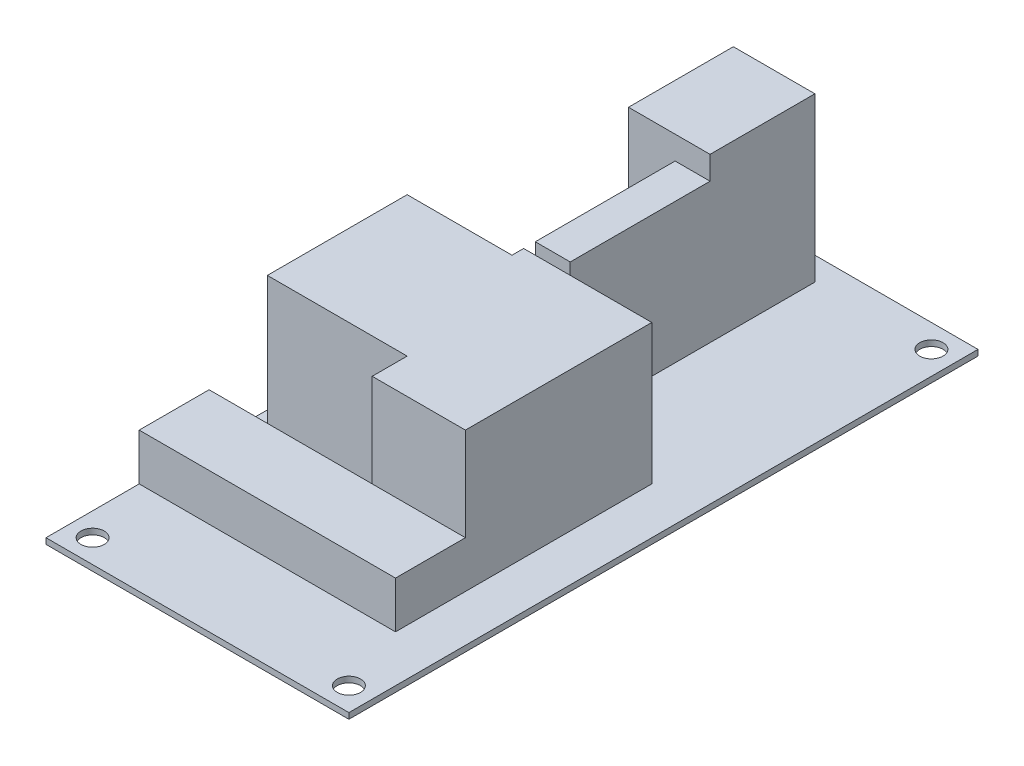
ISO-10303-21;
HEADER;
FILE_DESCRIPTION(('STEP AP214'),'2;1');
FILE_NAME('part.step','',(''),(''),'','','');
FILE_SCHEMA(('AUTOMOTIVE_DESIGN { 1 0 10303 214 1 1 1 1 }'));
ENDSEC;
DATA;
#1=APPLICATION_CONTEXT('core data for automotive mechanical design processes');
#2=APPLICATION_PROTOCOL_DEFINITION('international standard','automotive_design',2000,#1);
#3=PRODUCT_CONTEXT('',#1,'mechanical');
#4=PRODUCT('Part','Part','',(#3));
#5=PRODUCT_RELATED_PRODUCT_CATEGORY('part','',(#4));
#6=PRODUCT_DEFINITION_FORMATION('','',#4);
#7=PRODUCT_DEFINITION_CONTEXT('part definition',#1,'design');
#8=PRODUCT_DEFINITION('design','',#6,#7);
#9=PRODUCT_DEFINITION_SHAPE('','',#8);
#10=(LENGTH_UNIT() NAMED_UNIT(*) SI_UNIT(.MILLI.,.METRE.));
#11=(NAMED_UNIT(*) PLANE_ANGLE_UNIT() SI_UNIT($,.RADIAN.));
#12=(NAMED_UNIT(*) SI_UNIT($,.STERADIAN.) SOLID_ANGLE_UNIT());
#13=UNCERTAINTY_MEASURE_WITH_UNIT(LENGTH_MEASURE(1.E-05),#10,'distance_accuracy_value','');
#14=(GEOMETRIC_REPRESENTATION_CONTEXT(3) GLOBAL_UNCERTAINTY_ASSIGNED_CONTEXT((#13)) GLOBAL_UNIT_ASSIGNED_CONTEXT((#10,
#11,#12)) REPRESENTATION_CONTEXT('',''));
#15=CARTESIAN_POINT('',(0.,0.,0.));
#16=DIRECTION('',(0.,0.,1.));
#17=DIRECTION('',(1.,0.,0.));
#18=AXIS2_PLACEMENT_3D('',#15,#16,#17);
#19=CARTESIAN_POINT('',(0.,0.79375,0.));
#20=DIRECTION('',(0.,1.,0.));
#21=DIRECTION('',(0.,0.,1.));
#22=AXIS2_PLACEMENT_3D('',#19,#20,#21);
#23=PLANE('',#22);
#24=CARTESIAN_POINT('',(17.4625,0.79375,-39.6875));
#25=DIRECTION('',(0.,1.,0.));
#26=DIRECTION('',(0.,0.,1.));
#27=AXIS2_PLACEMENT_3D('',#24,#25,#26);
#28=CIRCLE('',#27,1.5875);
#29=CARTESIAN_POINT('',(17.4625,0.79375,-38.1));
#30=VERTEX_POINT('',#29);
#31=EDGE_CURVE('E786',#30,#30,#28,.T.);
#32=ORIENTED_EDGE('',*,*,#31,.F.);
#33=EDGE_LOOP('',(#32));
#34=FACE_BOUND('',#33,.T.);
#35=CARTESIAN_POINT('',(-17.4625,0.79375,39.6875));
#36=DIRECTION('',(0.,1.,0.));
#37=DIRECTION('',(0.,0.,1.));
#38=AXIS2_PLACEMENT_3D('',#35,#36,#37);
#39=CIRCLE('',#38,1.5875);
#40=CARTESIAN_POINT('',(-17.4625,0.79375,41.275));
#41=VERTEX_POINT('',#40);
#42=EDGE_CURVE('E792',#41,#41,#39,.T.);
#43=ORIENTED_EDGE('',*,*,#42,.F.);
#44=EDGE_LOOP('',(#43));
#45=FACE_BOUND('',#44,.T.);
#46=CARTESIAN_POINT('',(17.4625,0.79375,39.6875));
#47=DIRECTION('',(0.,1.,0.));
#48=DIRECTION('',(0.,0.,1.));
#49=AXIS2_PLACEMENT_3D('',#46,#47,#48);
#50=CIRCLE('',#49,1.5875);
#51=CARTESIAN_POINT('',(17.4625,0.79375,41.275));
#52=VERTEX_POINT('',#51);
#53=EDGE_CURVE('E839',#52,#52,#50,.T.);
#54=ORIENTED_EDGE('',*,*,#53,.F.);
#55=EDGE_LOOP('',(#54));
#56=FACE_BOUND('',#55,.T.);
#57=CARTESIAN_POINT('',(-17.4625,0.79375,-39.6875));
#58=DIRECTION('',(0.,1.,0.));
#59=DIRECTION('',(0.,0.,1.));
#60=AXIS2_PLACEMENT_3D('',#57,#58,#59);
#61=CIRCLE('',#60,1.5875);
#62=CARTESIAN_POINT('',(-17.4625,0.79375,-38.1));
#63=VERTEX_POINT('',#62);
#64=EDGE_CURVE('E789',#63,#63,#61,.T.);
#65=ORIENTED_EDGE('',*,*,#64,.F.);
#66=EDGE_LOOP('',(#65));
#67=FACE_BOUND('',#66,.T.);
#68=DIRECTION('',(-1.,0.,0.));
#69=VECTOR('',#68,1.);
#70=CARTESIAN_POINT('',(14.2875,0.79375,-4.76249999999999));
#71=LINE('',#70,#69);
#72=CARTESIAN_POINT('',(14.2875,0.79375,-4.76249999999999));
#73=VERTEX_POINT('',#72);
#74=CARTESIAN_POINT('',(-3.175,0.79375,-4.76249999999999));
#75=VERTEX_POINT('',#74);
#76=EDGE_CURVE('E301',#73,#75,#71,.T.);
#77=ORIENTED_EDGE('',*,*,#76,.F.);
#78=DIRECTION('',(0.,0.,-1.));
#79=VECTOR('',#78,1.);
#80=CARTESIAN_POINT('',(14.2875,0.79375,30.1625));
#81=LINE('',#80,#79);
#82=CARTESIAN_POINT('',(14.2875,0.79375,30.1625));
#83=VERTEX_POINT('',#82);
#84=EDGE_CURVE('E368',#83,#73,#81,.T.);
#85=ORIENTED_EDGE('',*,*,#84,.F.);
#86=DIRECTION('',(1.,0.,0.));
#87=VECTOR('',#86,1.);
#88=CARTESIAN_POINT('',(-20.6375,0.79375,30.1625));
#89=LINE('',#88,#87);
#90=CARTESIAN_POINT('',(-20.6375,0.79375,30.1625));
#91=VERTEX_POINT('',#90);
#92=EDGE_CURVE('E58',#91,#83,#89,.T.);
#93=ORIENTED_EDGE('',*,*,#92,.F.);
#94=DIRECTION('',(0.,0.,1.));
#95=VECTOR('',#94,1.);
#96=CARTESIAN_POINT('',(-20.6375,0.79375,-42.8625));
#97=LINE('',#96,#95);
#98=CARTESIAN_POINT('',(-20.6375,0.79375,42.8625));
#99=VERTEX_POINT('',#98);
#100=EDGE_CURVE('E386',#91,#99,#97,.T.);
#101=ORIENTED_EDGE('',*,*,#100,.T.);
#102=DIRECTION('',(1.,0.,0.));
#103=VECTOR('',#102,1.);
#104=CARTESIAN_POINT('',(-20.6375,0.79375,42.8625));
#105=LINE('',#104,#103);
#106=CARTESIAN_POINT('',(20.6375,0.79375,42.8625));
#107=VERTEX_POINT('',#106);
#108=EDGE_CURVE('E390',#99,#107,#105,.T.);
#109=ORIENTED_EDGE('',*,*,#108,.T.);
#110=DIRECTION('',(0.,0.,-1.));
#111=VECTOR('',#110,1.);
#112=CARTESIAN_POINT('',(20.6375,0.79375,-42.8625));
#113=LINE('',#112,#111);
#114=CARTESIAN_POINT('',(20.6375,0.79375,-42.8625));
#115=VERTEX_POINT('',#114);
#116=EDGE_CURVE('E380',#107,#115,#113,.T.);
#117=ORIENTED_EDGE('',*,*,#116,.T.);
#118=DIRECTION('',(-1.,0.,0.));
#119=VECTOR('',#118,1.);
#120=CARTESIAN_POINT('',(-20.6375,0.79375,-42.8625));
#121=LINE('',#120,#119);
#122=CARTESIAN_POINT('',(-20.6375,0.79375,-42.8625));
#123=VERTEX_POINT('',#122);
#124=EDGE_CURVE('E383',#115,#123,#121,.T.);
#125=ORIENTED_EDGE('',*,*,#124,.T.);
#126=CARTESIAN_POINT('',(-20.6375,0.79375,20.6375));
#127=VERTEX_POINT('',#126);
#128=EDGE_CURVE('E387',#123,#127,#97,.T.);
#129=ORIENTED_EDGE('',*,*,#128,.T.);
#130=DIRECTION('',(-1.,0.,0.));
#131=VECTOR('',#130,1.);
#132=CARTESIAN_POINT('',(-20.6375,0.79375,20.6375));
#133=LINE('',#132,#131);
#134=CARTESIAN_POINT('',(1.5875,0.79375,20.6375));
#135=VERTEX_POINT('',#134);
#136=EDGE_CURVE('E357',#135,#127,#133,.T.);
#137=ORIENTED_EDGE('',*,*,#136,.F.);
#138=DIRECTION('',(0.,0.,1.));
#139=VECTOR('',#138,1.);
#140=CARTESIAN_POINT('',(1.58749999999999,0.79375,15.875));
#141=LINE('',#140,#139);
#142=CARTESIAN_POINT('',(1.58749999999999,0.79375,15.875));
#143=VERTEX_POINT('',#142);
#144=EDGE_CURVE('E306',#143,#135,#141,.T.);
#145=ORIENTED_EDGE('',*,*,#144,.F.);
#146=DIRECTION('',(1.,0.,0.));
#147=VECTOR('',#146,1.);
#148=CARTESIAN_POINT('',(-17.4625,0.79375,15.875));
#149=LINE('',#148,#147);
#150=CARTESIAN_POINT('',(-17.4625,0.79375,15.875));
#151=VERTEX_POINT('',#150);
#152=EDGE_CURVE('E328',#151,#143,#149,.T.);
#153=ORIENTED_EDGE('',*,*,#152,.F.);
#154=DIRECTION('',(0.,0.,1.));
#155=VECTOR('',#154,1.);
#156=CARTESIAN_POINT('',(-17.4625,0.79375,-3.17499999999999));
#157=LINE('',#156,#155);
#158=CARTESIAN_POINT('',(-17.4625,0.79375,-3.17499999999999));
#159=VERTEX_POINT('',#158);
#160=EDGE_CURVE('E326',#159,#151,#157,.T.);
#161=ORIENTED_EDGE('',*,*,#160,.F.);
#162=DIRECTION('',(-1.,0.,0.));
#163=VECTOR('',#162,1.);
#164=CARTESIAN_POINT('',(-3.175,0.79375,-3.17499999999999));
#165=LINE('',#164,#163);
#166=CARTESIAN_POINT('',(-3.175,0.79375,-3.17499999999999));
#167=VERTEX_POINT('',#166);
#168=EDGE_CURVE('E324',#167,#159,#165,.T.);
#169=ORIENTED_EDGE('',*,*,#168,.F.);
#170=DIRECTION('',(0.,0.,1.));
#171=VECTOR('',#170,1.);
#172=CARTESIAN_POINT('',(-3.175,0.79375,-4.76249999999999));
#173=LINE('',#172,#171);
#174=EDGE_CURVE('E322',#75,#167,#173,.T.);
#175=ORIENTED_EDGE('',*,*,#174,.F.);
#176=EDGE_LOOP('',(#77,#85,#93,#101,#109,#117,#125,#129,#137,#145,#153,#161,#169,#175));
#177=FACE_BOUND('',#176,.T.);
#178=DIRECTION('',(0.,0.,1.));
#179=VECTOR('',#178,1.);
#180=CARTESIAN_POINT('',(-3.175,0.79375,-6.34999999999999));
#181=LINE('',#180,#179);
#182=CARTESIAN_POINT('',(-3.175,0.79375,-25.4));
#183=VERTEX_POINT('',#182);
#184=CARTESIAN_POINT('',(-3.175,0.79375,-20.6375));
#185=VERTEX_POINT('',#184);
#186=EDGE_CURVE('E239',#183,#185,#181,.T.);
#187=ORIENTED_EDGE('',*,*,#186,.F.);
#188=DIRECTION('',(1.,0.,0.));
#189=VECTOR('',#188,1.);
#190=CARTESIAN_POINT('',(-9.525,0.79375,-25.4));
#191=LINE('',#190,#189);
#192=CARTESIAN_POINT('',(-9.525,0.79375,-25.4));
#193=VERTEX_POINT('',#192);
#194=EDGE_CURVE('E808',#193,#183,#191,.T.);
#195=ORIENTED_EDGE('',*,*,#194,.F.);
#196=DIRECTION('',(0.,0.,1.));
#197=VECTOR('',#196,1.);
#198=CARTESIAN_POINT('',(-9.525,0.79375,-25.4));
#199=LINE('',#198,#197);
#200=CARTESIAN_POINT('',(-9.525,0.79375,-39.6875));
#201=VERTEX_POINT('',#200);
#202=EDGE_CURVE('E235',#201,#193,#199,.T.);
#203=ORIENTED_EDGE('',*,*,#202,.F.);
#204=DIRECTION('',(-1.,0.,0.));
#205=VECTOR('',#204,1.);
#206=CARTESIAN_POINT('',(-9.525,0.79375,-39.6875));
#207=LINE('',#206,#205);
#208=CARTESIAN_POINT('',(1.5875,0.79375,-39.6875));
#209=VERTEX_POINT('',#208);
#210=EDGE_CURVE('E231',#209,#201,#207,.T.);
#211=ORIENTED_EDGE('',*,*,#210,.F.);
#212=DIRECTION('',(0.,0.,-1.));
#213=VECTOR('',#212,1.);
#214=CARTESIAN_POINT('',(1.5875,0.79375,-6.34999999999999));
#215=LINE('',#214,#213);
#216=CARTESIAN_POINT('',(1.5875,0.79375,-6.34999999999999));
#217=VERTEX_POINT('',#216);
#218=EDGE_CURVE('E249',#217,#209,#215,.T.);
#219=ORIENTED_EDGE('',*,*,#218,.F.);
#220=DIRECTION('',(1.,0.,0.));
#221=VECTOR('',#220,1.);
#222=CARTESIAN_POINT('',(-3.175,0.79375,-6.34999999999999));
#223=LINE('',#222,#221);
#224=CARTESIAN_POINT('',(-3.175,0.79375,-6.34999999999999));
#225=VERTEX_POINT('',#224);
#226=EDGE_CURVE('E258',#225,#217,#223,.T.);
#227=ORIENTED_EDGE('',*,*,#226,.F.);
#228=CARTESIAN_POINT('',(-3.175,0.79375,-9.52499999999999));
#229=VERTEX_POINT('',#228);
#230=EDGE_CURVE('E237',#229,#225,#181,.T.);
#231=ORIENTED_EDGE('',*,*,#230,.F.);
#232=DIRECTION('',(1.,0.,0.));
#233=VECTOR('',#232,1.);
#234=CARTESIAN_POINT('',(-14.2875,0.79375,-9.52499999999999));
#235=LINE('',#234,#233);
#236=CARTESIAN_POINT('',(-14.2875,0.79375,-9.52499999999999));
#237=VERTEX_POINT('',#236);
#238=EDGE_CURVE('E288',#237,#229,#235,.T.);
#239=ORIENTED_EDGE('',*,*,#238,.F.);
#240=DIRECTION('',(0.,0.,1.));
#241=VECTOR('',#240,1.);
#242=CARTESIAN_POINT('',(-14.2875,0.79375,-9.52499999999999));
#243=LINE('',#242,#241);
#244=CARTESIAN_POINT('',(-14.2875,0.79375,-20.6375));
#245=VERTEX_POINT('',#244);
#246=EDGE_CURVE('E271',#245,#237,#243,.T.);
#247=ORIENTED_EDGE('',*,*,#246,.F.);
#248=DIRECTION('',(-1.,0.,0.));
#249=VECTOR('',#248,1.);
#250=CARTESIAN_POINT('',(-14.2875,0.79375,-20.6375));
#251=LINE('',#250,#249);
#252=EDGE_CURVE('E277',#185,#245,#251,.T.);
#253=ORIENTED_EDGE('',*,*,#252,.F.);
#254=EDGE_LOOP('',(#187,#195,#203,#211,#219,#227,#231,#239,#247,#253));
#255=FACE_BOUND('',#254,.T.);
#256=ADVANCED_FACE('F34',(#34,#45,#56,#67,#177,#255),#23,.T.);
#257=CARTESIAN_POINT('',(-20.6375,7.14375,20.6375));
#258=DIRECTION('',(0.,0.,1.));
#259=DIRECTION('',(1.,0.,0.));
#260=AXIS2_PLACEMENT_3D('',#257,#258,#259);
#261=PLANE('',#260);
#262=DIRECTION('',(0.,-1.,0.));
#263=VECTOR('',#262,1.);
#264=CARTESIAN_POINT('',(1.5875,19.84375,20.6375));
#265=LINE('',#264,#263);
#266=CARTESIAN_POINT('',(1.5875,7.14375,20.6375));
#267=VERTEX_POINT('',#266);
#268=EDGE_CURVE('E320',#267,#135,#265,.T.);
#269=ORIENTED_EDGE('',*,*,#268,.T.);
#270=ORIENTED_EDGE('',*,*,#136,.T.);
#271=DIRECTION('',(0.,-1.,0.));
#272=VECTOR('',#271,1.);
#273=CARTESIAN_POINT('',(-20.6375,7.14375,20.6375));
#274=LINE('',#273,#272);
#275=CARTESIAN_POINT('',(-20.6375,7.14375,20.6375));
#276=VERTEX_POINT('',#275);
#277=EDGE_CURVE('E366',#276,#127,#274,.T.);
#278=ORIENTED_EDGE('',*,*,#277,.F.);
#279=DIRECTION('',(-1.,0.,0.));
#280=VECTOR('',#279,1.);
#281=CARTESIAN_POINT('',(-20.6375,7.14375,20.6375));
#282=LINE('',#281,#280);
#283=EDGE_CURVE('E362',#267,#276,#282,.T.);
#284=ORIENTED_EDGE('',*,*,#283,.F.);
#285=EDGE_LOOP('',(#269,#270,#278,#284));
#286=FACE_BOUND('',#285,.T.);
#287=ADVANCED_FACE('F440',(#286),#261,.F.);
#288=CARTESIAN_POINT('',(20.6375,0.79375,-42.8625));
#289=DIRECTION('',(-1.,0.,0.));
#290=DIRECTION('',(0.,0.,1.));
#291=AXIS2_PLACEMENT_3D('',#288,#289,#290);
#292=PLANE('',#291);
#293=DIRECTION('',(0.,0.,-1.));
#294=VECTOR('',#293,1.);
#295=CARTESIAN_POINT('',(20.6375,0.,-42.8625));
#296=LINE('',#295,#294);
#297=CARTESIAN_POINT('',(20.6375,0.,42.8625));
#298=VERTEX_POINT('',#297);
#299=CARTESIAN_POINT('',(20.6375,0.,-42.8625));
#300=VERTEX_POINT('',#299);
#301=EDGE_CURVE('E379',#298,#300,#296,.T.);
#302=ORIENTED_EDGE('',*,*,#301,.T.);
#303=DIRECTION('',(0.,-1.,0.));
#304=VECTOR('',#303,1.);
#305=CARTESIAN_POINT('',(20.6375,0.79375,-42.8625));
#306=LINE('',#305,#304);
#307=EDGE_CURVE('E38',#115,#300,#306,.T.);
#308=ORIENTED_EDGE('',*,*,#307,.F.);
#309=ORIENTED_EDGE('',*,*,#116,.F.);
#310=DIRECTION('',(0.,-1.,0.));
#311=VECTOR('',#310,1.);
#312=CARTESIAN_POINT('',(20.6375,0.79375,42.8625));
#313=LINE('',#312,#311);
#314=EDGE_CURVE('E392',#107,#298,#313,.T.);
#315=ORIENTED_EDGE('',*,*,#314,.T.);
#316=EDGE_LOOP('',(#302,#308,#309,#315));
#317=FACE_BOUND('',#316,.T.);
#318=ADVANCED_FACE('F36',(#317),#292,.F.);
#319=CARTESIAN_POINT('',(-20.6375,0.79375,-42.8625));
#320=DIRECTION('',(0.,0.,1.));
#321=DIRECTION('',(1.,0.,0.));
#322=AXIS2_PLACEMENT_3D('',#319,#320,#321);
#323=PLANE('',#322);
#324=DIRECTION('',(-1.,0.,0.));
#325=VECTOR('',#324,1.);
#326=CARTESIAN_POINT('',(-20.6375,0.,-42.8625));
#327=LINE('',#326,#325);
#328=CARTESIAN_POINT('',(-20.6375,0.,-42.8625));
#329=VERTEX_POINT('',#328);
#330=EDGE_CURVE('E395',#300,#329,#327,.T.);
#331=ORIENTED_EDGE('',*,*,#330,.T.);
#332=DIRECTION('',(0.,-1.,0.));
#333=VECTOR('',#332,1.);
#334=CARTESIAN_POINT('',(-20.6375,0.79375,-42.8625));
#335=LINE('',#334,#333);
#336=EDGE_CURVE('E404',#123,#329,#335,.T.);
#337=ORIENTED_EDGE('',*,*,#336,.F.);
#338=ORIENTED_EDGE('',*,*,#124,.F.);
#339=ORIENTED_EDGE('',*,*,#307,.T.);
#340=EDGE_LOOP('',(#331,#337,#338,#339));
#341=FACE_BOUND('',#340,.T.);
#342=ADVANCED_FACE('F413',(#341),#323,.F.);
#343=CARTESIAN_POINT('',(-20.6375,0.79375,-42.8625));
#344=DIRECTION('',(1.,0.,0.));
#345=DIRECTION('',(0.,0.,-1.));
#346=AXIS2_PLACEMENT_3D('',#343,#344,#345);
#347=PLANE('',#346);
#348=DIRECTION('',(0.,0.,1.));
#349=VECTOR('',#348,1.);
#350=CARTESIAN_POINT('',(-20.6375,0.,-42.8625));
#351=LINE('',#350,#349);
#352=CARTESIAN_POINT('',(-20.6375,0.,42.8625));
#353=VERTEX_POINT('',#352);
#354=EDGE_CURVE('E397',#329,#353,#351,.T.);
#355=ORIENTED_EDGE('',*,*,#354,.T.);
#356=DIRECTION('',(0.,-1.,0.));
#357=VECTOR('',#356,1.);
#358=CARTESIAN_POINT('',(-20.6375,0.79375,42.8625));
#359=LINE('',#358,#357);
#360=EDGE_CURVE('E402',#99,#353,#359,.T.);
#361=ORIENTED_EDGE('',*,*,#360,.F.);
#362=ORIENTED_EDGE('',*,*,#100,.F.);
#363=DIRECTION('',(0.,-1.,0.));
#364=VECTOR('',#363,1.);
#365=CARTESIAN_POINT('',(-20.6375,7.14375,30.1625));
#366=LINE('',#365,#364);
#367=CARTESIAN_POINT('',(-20.6375,7.14375,30.1625));
#368=VERTEX_POINT('',#367);
#369=EDGE_CURVE('E376',#368,#91,#366,.T.);
#370=ORIENTED_EDGE('',*,*,#369,.F.);
#371=DIRECTION('',(0.,0.,1.));
#372=VECTOR('',#371,1.);
#373=CARTESIAN_POINT('',(-20.6375,7.14375,30.1625));
#374=LINE('',#373,#372);
#375=EDGE_CURVE('E353',#276,#368,#374,.T.);
#376=ORIENTED_EDGE('',*,*,#375,.F.);
#377=ORIENTED_EDGE('',*,*,#277,.T.);
#378=ORIENTED_EDGE('',*,*,#128,.F.);
#379=ORIENTED_EDGE('',*,*,#336,.T.);
#380=EDGE_LOOP('',(#355,#361,#362,#370,#376,#377,#378,#379));
#381=FACE_BOUND('',#380,.T.);
#382=ADVANCED_FACE('F422',(#381),#347,.F.);
#383=CARTESIAN_POINT('',(-20.6375,0.79375,42.8625));
#384=DIRECTION('',(0.,0.,-1.));
#385=DIRECTION('',(-1.,0.,0.));
#386=AXIS2_PLACEMENT_3D('',#383,#384,#385);
#387=PLANE('',#386);
#388=DIRECTION('',(1.,0.,0.));
#389=VECTOR('',#388,1.);
#390=CARTESIAN_POINT('',(-20.6375,0.,42.8625));
#391=LINE('',#390,#389);
#392=EDGE_CURVE('E384',#353,#298,#391,.T.);
#393=ORIENTED_EDGE('',*,*,#392,.T.);
#394=ORIENTED_EDGE('',*,*,#314,.F.);
#395=ORIENTED_EDGE('',*,*,#108,.F.);
#396=ORIENTED_EDGE('',*,*,#360,.T.);
#397=EDGE_LOOP('',(#393,#394,#395,#396));
#398=FACE_BOUND('',#397,.T.);
#399=ADVANCED_FACE('F425',(#398),#387,.F.);
#400=CARTESIAN_POINT('',(0.,0.,0.));
#401=DIRECTION('',(0.,1.,0.));
#402=DIRECTION('',(0.,0.,1.));
#403=AXIS2_PLACEMENT_3D('',#400,#401,#402);
#404=PLANE('',#403);
#405=CARTESIAN_POINT('',(17.4625,0.,-39.6875));
#406=DIRECTION('',(0.,1.,0.));
#407=DIRECTION('',(0.,0.,1.));
#408=AXIS2_PLACEMENT_3D('',#405,#406,#407);
#409=CIRCLE('',#408,1.5875);
#410=CARTESIAN_POINT('',(17.4625,0.,-38.1));
#411=VERTEX_POINT('',#410);
#412=EDGE_CURVE('E784',#411,#411,#409,.T.);
#413=ORIENTED_EDGE('',*,*,#412,.T.);
#414=EDGE_LOOP('',(#413));
#415=FACE_BOUND('',#414,.T.);
#416=CARTESIAN_POINT('',(-17.4625,0.,39.6875));
#417=DIRECTION('',(0.,1.,0.));
#418=DIRECTION('',(0.,0.,1.));
#419=AXIS2_PLACEMENT_3D('',#416,#417,#418);
#420=CIRCLE('',#419,1.5875);
#421=CARTESIAN_POINT('',(-17.4625,0.,41.275));
#422=VERTEX_POINT('',#421);
#423=EDGE_CURVE('E787',#422,#422,#420,.T.);
#424=ORIENTED_EDGE('',*,*,#423,.T.);
#425=EDGE_LOOP('',(#424));
#426=FACE_BOUND('',#425,.T.);
#427=CARTESIAN_POINT('',(17.4625,0.,39.6875));
#428=DIRECTION('',(0.,1.,0.));
#429=DIRECTION('',(0.,0.,1.));
#430=AXIS2_PLACEMENT_3D('',#427,#428,#429);
#431=CIRCLE('',#430,1.5875);
#432=CARTESIAN_POINT('',(17.4625,0.,41.275));
#433=VERTEX_POINT('',#432);
#434=EDGE_CURVE('E798',#433,#433,#431,.T.);
#435=ORIENTED_EDGE('',*,*,#434,.T.);
#436=EDGE_LOOP('',(#435));
#437=FACE_BOUND('',#436,.T.);
#438=CARTESIAN_POINT('',(-17.4625,0.,-39.6875));
#439=DIRECTION('',(0.,1.,0.));
#440=DIRECTION('',(0.,0.,1.));
#441=AXIS2_PLACEMENT_3D('',#438,#439,#440);
#442=CIRCLE('',#441,1.5875);
#443=CARTESIAN_POINT('',(-17.4625,0.,-38.1));
#444=VERTEX_POINT('',#443);
#445=EDGE_CURVE('E799',#444,#444,#442,.T.);
#446=ORIENTED_EDGE('',*,*,#445,.T.);
#447=EDGE_LOOP('',(#446));
#448=FACE_BOUND('',#447,.T.);
#449=ORIENTED_EDGE('',*,*,#301,.F.);
#450=ORIENTED_EDGE('',*,*,#392,.F.);
#451=ORIENTED_EDGE('',*,*,#354,.F.);
#452=ORIENTED_EDGE('',*,*,#330,.F.);
#453=EDGE_LOOP('',(#449,#450,#451,#452));
#454=FACE_BOUND('',#453,.T.);
#455=ADVANCED_FACE('F420',(#415,#426,#437,#448,#454),#404,.F.);
#456=CARTESIAN_POINT('',(-20.6375,7.14375,30.1625));
#457=DIRECTION('',(0.,0.,-1.));
#458=DIRECTION('',(-1.,0.,0.));
#459=AXIS2_PLACEMENT_3D('',#456,#457,#458);
#460=PLANE('',#459);
#461=ORIENTED_EDGE('',*,*,#92,.T.);
#462=DIRECTION('',(0.,-1.,0.));
#463=VECTOR('',#462,1.);
#464=CARTESIAN_POINT('',(14.2875,7.14375,30.1625));
#465=LINE('',#464,#463);
#466=CARTESIAN_POINT('',(14.2875,7.14375,30.1625));
#467=VERTEX_POINT('',#466);
#468=EDGE_CURVE('E373',#467,#83,#465,.T.);
#469=ORIENTED_EDGE('',*,*,#468,.F.);
#470=DIRECTION('',(1.,0.,0.));
#471=VECTOR('',#470,1.);
#472=CARTESIAN_POINT('',(-20.6375,7.14375,30.1625));
#473=LINE('',#472,#471);
#474=EDGE_CURVE('E356',#368,#467,#473,.T.);
#475=ORIENTED_EDGE('',*,*,#474,.F.);
#476=ORIENTED_EDGE('',*,*,#369,.T.);
#477=EDGE_LOOP('',(#461,#469,#475,#476));
#478=FACE_BOUND('',#477,.T.);
#479=ADVANCED_FACE('F431',(#478),#460,.F.);
#480=CARTESIAN_POINT('',(14.2875,7.14375,30.1625));
#481=DIRECTION('',(-1.,0.,0.));
#482=DIRECTION('',(0.,0.,1.));
#483=AXIS2_PLACEMENT_3D('',#480,#481,#482);
#484=PLANE('',#483);
#485=ORIENTED_EDGE('',*,*,#84,.T.);
#486=DIRECTION('',(0.,-1.,0.));
#487=VECTOR('',#486,1.);
#488=CARTESIAN_POINT('',(14.2875,19.84375,-4.76249999999999));
#489=LINE('',#488,#487);
#490=CARTESIAN_POINT('',(14.2875,19.84375,-4.76249999999999));
#491=VERTEX_POINT('',#490);
#492=EDGE_CURVE('E347',#491,#73,#489,.T.);
#493=ORIENTED_EDGE('',*,*,#492,.F.);
#494=DIRECTION('',(0.,0.,-1.));
#495=VECTOR('',#494,1.);
#496=CARTESIAN_POINT('',(14.2875,19.84375,20.6375));
#497=LINE('',#496,#495);
#498=CARTESIAN_POINT('',(14.2875,19.84375,20.6375));
#499=VERTEX_POINT('',#498);
#500=EDGE_CURVE('E305',#499,#491,#497,.T.);
#501=ORIENTED_EDGE('',*,*,#500,.F.);
#502=DIRECTION('',(0.,-1.,0.));
#503=VECTOR('',#502,1.);
#504=CARTESIAN_POINT('',(14.2875,19.84375,20.6375));
#505=LINE('',#504,#503);
#506=CARTESIAN_POINT('',(14.2875,7.14375,20.6375));
#507=VERTEX_POINT('',#506);
#508=EDGE_CURVE('E350',#499,#507,#505,.T.);
#509=ORIENTED_EDGE('',*,*,#508,.T.);
#510=DIRECTION('',(0.,0.,-1.));
#511=VECTOR('',#510,1.);
#512=CARTESIAN_POINT('',(14.2875,7.14375,30.1625));
#513=LINE('',#512,#511);
#514=EDGE_CURVE('E359',#467,#507,#513,.T.);
#515=ORIENTED_EDGE('',*,*,#514,.F.);
#516=ORIENTED_EDGE('',*,*,#468,.T.);
#517=EDGE_LOOP('',(#485,#493,#501,#509,#515,#516));
#518=FACE_BOUND('',#517,.T.);
#519=ADVANCED_FACE('F472',(#518),#484,.F.);
#520=CARTESIAN_POINT('',(0.,7.14375,0.));
#521=DIRECTION('',(0.,-1.,0.));
#522=DIRECTION('',(0.,0.,-1.));
#523=AXIS2_PLACEMENT_3D('',#520,#521,#522);
#524=PLANE('',#523);
#525=ORIENTED_EDGE('',*,*,#375,.T.);
#526=ORIENTED_EDGE('',*,*,#474,.T.);
#527=ORIENTED_EDGE('',*,*,#514,.T.);
#528=EDGE_CURVE('E363',#507,#267,#282,.T.);
#529=ORIENTED_EDGE('',*,*,#528,.T.);
#530=ORIENTED_EDGE('',*,*,#283,.T.);
#531=EDGE_LOOP('',(#525,#526,#527,#529,#530));
#532=FACE_BOUND('',#531,.T.);
#533=ADVANCED_FACE('F435',(#532),#524,.F.);
#534=CARTESIAN_POINT('',(1.5875,19.84375,20.6375));
#535=DIRECTION('',(0.,0.,-1.));
#536=DIRECTION('',(-1.,0.,0.));
#537=AXIS2_PLACEMENT_3D('',#534,#535,#536);
#538=PLANE('',#537);
#539=CARTESIAN_POINT('',(1.5875,19.84375,20.6375));
#540=VERTEX_POINT('',#539);
#541=EDGE_CURVE('E50',#540,#267,#265,.T.);
#542=ORIENTED_EDGE('',*,*,#541,.T.);
#543=ORIENTED_EDGE('',*,*,#528,.F.);
#544=ORIENTED_EDGE('',*,*,#508,.F.);
#545=DIRECTION('',(1.,0.,0.));
#546=VECTOR('',#545,1.);
#547=CARTESIAN_POINT('',(1.5875,19.84375,20.6375));
#548=LINE('',#547,#546);
#549=EDGE_CURVE('E302',#540,#499,#548,.T.);
#550=ORIENTED_EDGE('',*,*,#549,.F.);
#551=EDGE_LOOP('',(#542,#543,#544,#550));
#552=FACE_BOUND('',#551,.T.);
#553=ADVANCED_FACE('F474',(#552),#538,.F.);
#554=CARTESIAN_POINT('',(14.2875,19.84375,-4.76249999999999));
#555=DIRECTION('',(0.,0.,1.));
#556=DIRECTION('',(1.,0.,0.));
#557=AXIS2_PLACEMENT_3D('',#554,#555,#556);
#558=PLANE('',#557);
#559=ORIENTED_EDGE('',*,*,#76,.T.);
#560=DIRECTION('',(0.,-1.,0.));
#561=VECTOR('',#560,1.);
#562=CARTESIAN_POINT('',(-3.175,19.84375,-4.76249999999999));
#563=LINE('',#562,#561);
#564=CARTESIAN_POINT('',(-3.175,19.84375,-4.76249999999999));
#565=VERTEX_POINT('',#564);
#566=EDGE_CURVE('E344',#565,#75,#563,.T.);
#567=ORIENTED_EDGE('',*,*,#566,.F.);
#568=DIRECTION('',(-1.,0.,0.));
#569=VECTOR('',#568,1.);
#570=CARTESIAN_POINT('',(14.2875,19.84375,-4.76249999999999));
#571=LINE('',#570,#569);
#572=EDGE_CURVE('E308',#491,#565,#571,.T.);
#573=ORIENTED_EDGE('',*,*,#572,.F.);
#574=ORIENTED_EDGE('',*,*,#492,.T.);
#575=EDGE_LOOP('',(#559,#567,#573,#574));
#576=FACE_BOUND('',#575,.T.);
#577=ADVANCED_FACE('F469',(#576),#558,.F.);
#578=CARTESIAN_POINT('',(-3.175,19.84375,-4.76249999999999));
#579=DIRECTION('',(1.,0.,0.));
#580=DIRECTION('',(0.,0.,-1.));
#581=AXIS2_PLACEMENT_3D('',#578,#579,#580);
#582=PLANE('',#581);
#583=ORIENTED_EDGE('',*,*,#174,.T.);
#584=DIRECTION('',(0.,-1.,0.));
#585=VECTOR('',#584,1.);
#586=CARTESIAN_POINT('',(-3.175,19.84375,-3.17499999999999));
#587=LINE('',#586,#585);
#588=CARTESIAN_POINT('',(-3.175,19.84375,-3.17499999999999));
#589=VERTEX_POINT('',#588);
#590=EDGE_CURVE('E341',#589,#167,#587,.T.);
#591=ORIENTED_EDGE('',*,*,#590,.F.);
#592=DIRECTION('',(0.,0.,1.));
#593=VECTOR('',#592,1.);
#594=CARTESIAN_POINT('',(-3.175,19.84375,-4.76249999999999));
#595=LINE('',#594,#593);
#596=EDGE_CURVE('E310',#565,#589,#595,.T.);
#597=ORIENTED_EDGE('',*,*,#596,.F.);
#598=ORIENTED_EDGE('',*,*,#566,.T.);
#599=EDGE_LOOP('',(#583,#591,#597,#598));
#600=FACE_BOUND('',#599,.T.);
#601=ADVANCED_FACE('F465',(#600),#582,.F.);
#602=CARTESIAN_POINT('',(-3.175,19.84375,-3.17499999999999));
#603=DIRECTION('',(0.,0.,1.));
#604=DIRECTION('',(1.,0.,0.));
#605=AXIS2_PLACEMENT_3D('',#602,#603,#604);
#606=PLANE('',#605);
#607=ORIENTED_EDGE('',*,*,#168,.T.);
#608=DIRECTION('',(0.,-1.,0.));
#609=VECTOR('',#608,1.);
#610=CARTESIAN_POINT('',(-17.4625,19.84375,-3.17499999999999));
#611=LINE('',#610,#609);
#612=CARTESIAN_POINT('',(-17.4625,19.84375,-3.17499999999999));
#613=VERTEX_POINT('',#612);
#614=EDGE_CURVE('E338',#613,#159,#611,.T.);
#615=ORIENTED_EDGE('',*,*,#614,.F.);
#616=DIRECTION('',(-1.,0.,0.));
#617=VECTOR('',#616,1.);
#618=CARTESIAN_POINT('',(-3.175,19.84375,-3.17499999999999));
#619=LINE('',#618,#617);
#620=EDGE_CURVE('E312',#589,#613,#619,.T.);
#621=ORIENTED_EDGE('',*,*,#620,.F.);
#622=ORIENTED_EDGE('',*,*,#590,.T.);
#623=EDGE_LOOP('',(#607,#615,#621,#622));
#624=FACE_BOUND('',#623,.T.);
#625=ADVANCED_FACE('F460',(#624),#606,.F.);
#626=CARTESIAN_POINT('',(-17.4625,19.84375,-3.17499999999999));
#627=DIRECTION('',(1.,0.,0.));
#628=DIRECTION('',(0.,0.,-1.));
#629=AXIS2_PLACEMENT_3D('',#626,#627,#628);
#630=PLANE('',#629);
#631=ORIENTED_EDGE('',*,*,#160,.T.);
#632=DIRECTION('',(0.,-1.,0.));
#633=VECTOR('',#632,1.);
#634=CARTESIAN_POINT('',(-17.4625,19.84375,15.875));
#635=LINE('',#634,#633);
#636=CARTESIAN_POINT('',(-17.4625,19.84375,15.875));
#637=VERTEX_POINT('',#636);
#638=EDGE_CURVE('E335',#637,#151,#635,.T.);
#639=ORIENTED_EDGE('',*,*,#638,.F.);
#640=DIRECTION('',(0.,0.,1.));
#641=VECTOR('',#640,1.);
#642=CARTESIAN_POINT('',(-17.4625,19.84375,-3.17499999999999));
#643=LINE('',#642,#641);
#644=EDGE_CURVE('E314',#613,#637,#643,.T.);
#645=ORIENTED_EDGE('',*,*,#644,.F.);
#646=ORIENTED_EDGE('',*,*,#614,.T.);
#647=EDGE_LOOP('',(#631,#639,#645,#646));
#648=FACE_BOUND('',#647,.T.);
#649=ADVANCED_FACE('F455',(#648),#630,.F.);
#650=CARTESIAN_POINT('',(-17.4625,19.84375,15.875));
#651=DIRECTION('',(0.,0.,-1.));
#652=DIRECTION('',(-1.,0.,0.));
#653=AXIS2_PLACEMENT_3D('',#650,#651,#652);
#654=PLANE('',#653);
#655=ORIENTED_EDGE('',*,*,#152,.T.);
#656=DIRECTION('',(0.,-1.,0.));
#657=VECTOR('',#656,1.);
#658=CARTESIAN_POINT('',(1.58749999999999,19.84375,15.875));
#659=LINE('',#658,#657);
#660=CARTESIAN_POINT('',(1.58749999999999,19.84375,15.875));
#661=VERTEX_POINT('',#660);
#662=EDGE_CURVE('E332',#661,#143,#659,.T.);
#663=ORIENTED_EDGE('',*,*,#662,.F.);
#664=DIRECTION('',(1.,0.,0.));
#665=VECTOR('',#664,1.);
#666=CARTESIAN_POINT('',(-17.4625,19.84375,15.875));
#667=LINE('',#666,#665);
#668=EDGE_CURVE('E316',#637,#661,#667,.T.);
#669=ORIENTED_EDGE('',*,*,#668,.F.);
#670=ORIENTED_EDGE('',*,*,#638,.T.);
#671=EDGE_LOOP('',(#655,#663,#669,#670));
#672=FACE_BOUND('',#671,.T.);
#673=ADVANCED_FACE('F451',(#672),#654,.F.);
#674=CARTESIAN_POINT('',(1.58749999999999,19.84375,15.875));
#675=DIRECTION('',(1.,0.,0.));
#676=DIRECTION('',(0.,0.,-1.));
#677=AXIS2_PLACEMENT_3D('',#674,#675,#676);
#678=PLANE('',#677);
#679=ORIENTED_EDGE('',*,*,#144,.T.);
#680=ORIENTED_EDGE('',*,*,#268,.F.);
#681=ORIENTED_EDGE('',*,*,#541,.F.);
#682=DIRECTION('',(0.,0.,1.));
#683=VECTOR('',#682,1.);
#684=CARTESIAN_POINT('',(1.58749999999999,19.84375,15.875));
#685=LINE('',#684,#683);
#686=EDGE_CURVE('E318',#661,#540,#685,.T.);
#687=ORIENTED_EDGE('',*,*,#686,.F.);
#688=ORIENTED_EDGE('',*,*,#662,.T.);
#689=EDGE_LOOP('',(#679,#680,#681,#687,#688));
#690=FACE_BOUND('',#689,.T.);
#691=ADVANCED_FACE('F446',(#690),#678,.F.);
#692=CARTESIAN_POINT('',(0.,19.84375,0.));
#693=DIRECTION('',(0.,1.,0.));
#694=DIRECTION('',(0.,0.,1.));
#695=AXIS2_PLACEMENT_3D('',#692,#693,#694);
#696=PLANE('',#695);
#697=ORIENTED_EDGE('',*,*,#549,.T.);
#698=ORIENTED_EDGE('',*,*,#500,.T.);
#699=ORIENTED_EDGE('',*,*,#572,.T.);
#700=ORIENTED_EDGE('',*,*,#596,.T.);
#701=ORIENTED_EDGE('',*,*,#620,.T.);
#702=ORIENTED_EDGE('',*,*,#644,.T.);
#703=ORIENTED_EDGE('',*,*,#668,.T.);
#704=ORIENTED_EDGE('',*,*,#686,.T.);
#705=EDGE_LOOP('',(#697,#698,#699,#700,#701,#702,#703,#704));
#706=FACE_BOUND('',#705,.T.);
#707=ADVANCED_FACE('F476',(#706),#696,.T.);
#708=CARTESIAN_POINT('',(-14.2875,7.14375,-9.52499999999999));
#709=DIRECTION('',(1.,0.,0.));
#710=DIRECTION('',(0.,0.,-1.));
#711=AXIS2_PLACEMENT_3D('',#708,#709,#710);
#712=PLANE('',#711);
#713=ORIENTED_EDGE('',*,*,#246,.T.);
#714=DIRECTION('',(0.,-1.,0.));
#715=VECTOR('',#714,1.);
#716=CARTESIAN_POINT('',(-14.2875,7.14375,-9.52499999999999));
#717=LINE('',#716,#715);
#718=CARTESIAN_POINT('',(-14.2875,7.14375,-9.52499999999999));
#719=VERTEX_POINT('',#718);
#720=EDGE_CURVE('E299',#719,#237,#717,.T.);
#721=ORIENTED_EDGE('',*,*,#720,.F.);
#722=DIRECTION('',(0.,0.,1.));
#723=VECTOR('',#722,1.);
#724=CARTESIAN_POINT('',(-14.2875,7.14375,-9.52499999999999));
#725=LINE('',#724,#723);
#726=CARTESIAN_POINT('',(-14.2875,7.14375,-20.6375));
#727=VERTEX_POINT('',#726);
#728=EDGE_CURVE('E273',#727,#719,#725,.T.);
#729=ORIENTED_EDGE('',*,*,#728,.F.);
#730=DIRECTION('',(0.,-1.,0.));
#731=VECTOR('',#730,1.);
#732=CARTESIAN_POINT('',(-14.2875,7.14375,-20.6375));
#733=LINE('',#732,#731);
#734=EDGE_CURVE('E285',#727,#245,#733,.T.);
#735=ORIENTED_EDGE('',*,*,#734,.T.);
#736=EDGE_LOOP('',(#713,#721,#729,#735));
#737=FACE_BOUND('',#736,.T.);
#738=ADVANCED_FACE('F478',(#737),#712,.F.);
#739=CARTESIAN_POINT('',(-14.2875,7.14375,-9.52499999999999));
#740=DIRECTION('',(0.,0.,-1.));
#741=DIRECTION('',(-1.,0.,0.));
#742=AXIS2_PLACEMENT_3D('',#739,#740,#741);
#743=PLANE('',#742);
#744=ORIENTED_EDGE('',*,*,#238,.T.);
#745=DIRECTION('',(0.,-1.,0.));
#746=VECTOR('',#745,1.);
#747=CARTESIAN_POINT('',(-3.175,7.14375,-9.52499999999999));
#748=LINE('',#747,#746);
#749=CARTESIAN_POINT('',(-3.175,7.14375,-9.52499999999999));
#750=VERTEX_POINT('',#749);
#751=EDGE_CURVE('E297',#750,#229,#748,.T.);
#752=ORIENTED_EDGE('',*,*,#751,.F.);
#753=DIRECTION('',(1.,0.,0.));
#754=VECTOR('',#753,1.);
#755=CARTESIAN_POINT('',(-14.2875,7.14375,-9.52499999999999));
#756=LINE('',#755,#754);
#757=EDGE_CURVE('E276',#719,#750,#756,.T.);
#758=ORIENTED_EDGE('',*,*,#757,.F.);
#759=ORIENTED_EDGE('',*,*,#720,.T.);
#760=EDGE_LOOP('',(#744,#752,#758,#759));
#761=FACE_BOUND('',#760,.T.);
#762=ADVANCED_FACE('F484',(#761),#743,.F.);
#763=CARTESIAN_POINT('',(-14.2875,7.14375,-20.6375));
#764=DIRECTION('',(0.,0.,1.));
#765=DIRECTION('',(1.,0.,0.));
#766=AXIS2_PLACEMENT_3D('',#763,#764,#765);
#767=PLANE('',#766);
#768=ORIENTED_EDGE('',*,*,#252,.T.);
#769=ORIENTED_EDGE('',*,*,#734,.F.);
#770=DIRECTION('',(-1.,0.,0.));
#771=VECTOR('',#770,1.);
#772=CARTESIAN_POINT('',(-14.2875,7.14375,-20.6375));
#773=LINE('',#772,#771);
#774=CARTESIAN_POINT('',(-3.175,7.14375,-20.6375));
#775=VERTEX_POINT('',#774);
#776=EDGE_CURVE('E283',#775,#727,#773,.T.);
#777=ORIENTED_EDGE('',*,*,#776,.F.);
#778=DIRECTION('',(0.,-1.,0.));
#779=VECTOR('',#778,1.);
#780=CARTESIAN_POINT('',(-3.175,7.14375,-20.6375));
#781=LINE('',#780,#779);
#782=EDGE_CURVE('E294',#775,#185,#781,.T.);
#783=ORIENTED_EDGE('',*,*,#782,.T.);
#784=EDGE_LOOP('',(#768,#769,#777,#783));
#785=FACE_BOUND('',#784,.T.);
#786=ADVANCED_FACE('F636',(#785),#767,.F.);
#787=CARTESIAN_POINT('',(0.,7.14375,0.));
#788=DIRECTION('',(0.,-1.,0.));
#789=DIRECTION('',(0.,0.,-1.));
#790=AXIS2_PLACEMENT_3D('',#787,#788,#789);
#791=PLANE('',#790);
#792=CARTESIAN_POINT('',(-8.73125,7.14375,-15.08125));
#793=DIRECTION('',(0.,1.,0.));
#794=DIRECTION('',(0.,0.,1.));
#795=AXIS2_PLACEMENT_3D('',#792,#793,#794);
#796=CIRCLE('',#795,2.38125);
#797=CARTESIAN_POINT('',(-8.73125,7.14375,-12.7));
#798=VERTEX_POINT('',#797);
#799=EDGE_CURVE('E11',#798,#798,#796,.T.);
#800=ORIENTED_EDGE('',*,*,#799,.F.);
#801=EDGE_LOOP('',(#800));
#802=FACE_BOUND('',#801,.T.);
#803=ORIENTED_EDGE('',*,*,#728,.T.);
#804=ORIENTED_EDGE('',*,*,#757,.T.);
#805=DIRECTION('',(0.,0.,-1.));
#806=VECTOR('',#805,1.);
#807=CARTESIAN_POINT('',(-3.175,7.14375,-9.52499999999999));
#808=LINE('',#807,#806);
#809=EDGE_CURVE('E280',#750,#775,#808,.T.);
#810=ORIENTED_EDGE('',*,*,#809,.T.);
#811=ORIENTED_EDGE('',*,*,#776,.T.);
#812=EDGE_LOOP('',(#803,#804,#810,#811));
#813=FACE_BOUND('',#812,.T.);
#814=ADVANCED_FACE('F614',(#802,#813),#791,.F.);
#815=CARTESIAN_POINT('',(-8.73125,10.31875,-15.08125));
#816=DIRECTION('',(0.,-1.,0.));
#817=DIRECTION('',(0.,0.,-1.));
#818=AXIS2_PLACEMENT_3D('',#815,#816,#817);
#819=CYLINDRICAL_SURFACE('',#818,2.38125);
#820=CARTESIAN_POINT('',(-8.73125,10.31875,-15.08125));
#821=DIRECTION('',(0.,1.,0.));
#822=DIRECTION('',(0.,0.,1.));
#823=AXIS2_PLACEMENT_3D('',#820,#821,#822);
#824=CIRCLE('',#823,2.38125);
#825=CARTESIAN_POINT('',(-8.73125,10.31875,-12.7));
#826=VERTEX_POINT('',#825);
#827=EDGE_CURVE('E269',#826,#826,#824,.T.);
#828=ORIENTED_EDGE('',*,*,#827,.F.);
#829=EDGE_LOOP('',(#828));
#830=FACE_BOUND('',#829,.T.);
#831=ORIENTED_EDGE('',*,*,#799,.T.);
#832=EDGE_LOOP('',(#831));
#833=FACE_BOUND('',#832,.T.);
#834=ADVANCED_FACE('F608',(#830,#833),#819,.T.);
#835=CARTESIAN_POINT('',(-8.73125,10.31875,-15.08125));
#836=DIRECTION('',(0.,1.,0.));
#837=DIRECTION('',(0.,0.,1.));
#838=AXIS2_PLACEMENT_3D('',#835,#836,#837);
#839=PLANE('',#838);
#840=ORIENTED_EDGE('',*,*,#827,.T.);
#841=EDGE_LOOP('',(#840));
#842=FACE_BOUND('',#841,.T.);
#843=ADVANCED_FACE('F613',(#842),#839,.T.);
#844=CARTESIAN_POINT('',(-3.175,19.84375,-6.34999999999999));
#845=DIRECTION('',(1.,0.,0.));
#846=DIRECTION('',(0.,0.,-1.));
#847=AXIS2_PLACEMENT_3D('',#844,#845,#846);
#848=PLANE('',#847);
#849=ORIENTED_EDGE('',*,*,#809,.F.);
#850=ORIENTED_EDGE('',*,*,#751,.T.);
#851=ORIENTED_EDGE('',*,*,#230,.T.);
#852=DIRECTION('',(0.,-1.,0.));
#853=VECTOR('',#852,1.);
#854=CARTESIAN_POINT('',(-3.175,19.84375,-6.34999999999999));
#855=LINE('',#854,#853);
#856=CARTESIAN_POINT('',(-3.175,19.84375,-6.34999999999999));
#857=VERTEX_POINT('',#856);
#858=EDGE_CURVE('E266',#857,#225,#855,.T.);
#859=ORIENTED_EDGE('',*,*,#858,.F.);
#860=DIRECTION('',(0.,0.,1.));
#861=VECTOR('',#860,1.);
#862=CARTESIAN_POINT('',(-3.175,19.84375,-6.34999999999999));
#863=LINE('',#862,#861);
#864=CARTESIAN_POINT('',(-3.175,19.84375,-25.4));
#865=VERTEX_POINT('',#864);
#866=EDGE_CURVE('E245',#865,#857,#863,.T.);
#867=ORIENTED_EDGE('',*,*,#866,.F.);
#868=DIRECTION('',(0.,-1.,0.));
#869=VECTOR('',#868,1.);
#870=CARTESIAN_POINT('',(-3.175,19.84375,-25.4));
#871=LINE('',#870,#869);
#872=EDGE_CURVE('E256',#865,#183,#871,.T.);
#873=ORIENTED_EDGE('',*,*,#872,.T.);
#874=ORIENTED_EDGE('',*,*,#186,.T.);
#875=ORIENTED_EDGE('',*,*,#782,.F.);
#876=EDGE_LOOP('',(#849,#850,#851,#859,#867,#873,#874,#875));
#877=FACE_BOUND('',#876,.T.);
#878=ADVANCED_FACE('F626',(#877),#848,.F.);
#879=CARTESIAN_POINT('',(-3.175,19.84375,-6.34999999999999));
#880=DIRECTION('',(0.,0.,-1.));
#881=DIRECTION('',(-1.,0.,0.));
#882=AXIS2_PLACEMENT_3D('',#879,#880,#881);
#883=PLANE('',#882);
#884=ORIENTED_EDGE('',*,*,#226,.T.);
#885=DIRECTION('',(0.,-1.,0.));
#886=VECTOR('',#885,1.);
#887=CARTESIAN_POINT('',(1.5875,19.84375,-6.34999999999999));
#888=LINE('',#887,#886);
#889=CARTESIAN_POINT('',(1.5875,19.84375,-6.34999999999999));
#890=VERTEX_POINT('',#889);
#891=EDGE_CURVE('E263',#890,#217,#888,.T.);
#892=ORIENTED_EDGE('',*,*,#891,.F.);
#893=DIRECTION('',(1.,0.,0.));
#894=VECTOR('',#893,1.);
#895=CARTESIAN_POINT('',(-3.175,19.84375,-6.34999999999999));
#896=LINE('',#895,#894);
#897=EDGE_CURVE('E248',#857,#890,#896,.T.);
#898=ORIENTED_EDGE('',*,*,#897,.F.);
#899=ORIENTED_EDGE('',*,*,#858,.T.);
#900=EDGE_LOOP('',(#884,#892,#898,#899));
#901=FACE_BOUND('',#900,.T.);
#902=ADVANCED_FACE('F658',(#901),#883,.F.);
#903=CARTESIAN_POINT('',(1.5875,19.84375,-6.34999999999999));
#904=DIRECTION('',(-1.,0.,0.));
#905=DIRECTION('',(0.,0.,1.));
#906=AXIS2_PLACEMENT_3D('',#903,#904,#905);
#907=PLANE('',#906);
#908=ORIENTED_EDGE('',*,*,#218,.T.);
#909=DIRECTION('',(0.,-1.,0.));
#910=VECTOR('',#909,1.);
#911=CARTESIAN_POINT('',(1.5875,23.01875,-39.6875));
#912=LINE('',#911,#910);
#913=CARTESIAN_POINT('',(1.5875,23.01875,-39.6875));
#914=VERTEX_POINT('',#913);
#915=EDGE_CURVE('E241',#914,#209,#912,.T.);
#916=ORIENTED_EDGE('',*,*,#915,.F.);
#917=DIRECTION('',(0.,0.,-1.));
#918=VECTOR('',#917,1.);
#919=CARTESIAN_POINT('',(1.5875,23.01875,-25.4));
#920=LINE('',#919,#918);
#921=CARTESIAN_POINT('',(1.5875,23.01875,-25.4));
#922=VERTEX_POINT('',#921);
#923=EDGE_CURVE('E221',#922,#914,#920,.T.);
#924=ORIENTED_EDGE('',*,*,#923,.F.);
#925=DIRECTION('',(0.,-1.,0.));
#926=VECTOR('',#925,1.);
#927=CARTESIAN_POINT('',(1.5875,23.01875,-25.4));
#928=LINE('',#927,#926);
#929=CARTESIAN_POINT('',(1.5875,19.84375,-25.4));
#930=VERTEX_POINT('',#929);
#931=EDGE_CURVE('E218',#922,#930,#928,.T.);
#932=ORIENTED_EDGE('',*,*,#931,.T.);
#933=DIRECTION('',(0.,0.,-1.));
#934=VECTOR('',#933,1.);
#935=CARTESIAN_POINT('',(1.5875,19.84375,-6.34999999999999));
#936=LINE('',#935,#934);
#937=EDGE_CURVE('E251',#890,#930,#936,.T.);
#938=ORIENTED_EDGE('',*,*,#937,.F.);
#939=ORIENTED_EDGE('',*,*,#891,.T.);
#940=EDGE_LOOP('',(#908,#916,#924,#932,#938,#939));
#941=FACE_BOUND('',#940,.T.);
#942=ADVANCED_FACE('F663',(#941),#907,.F.);
#943=CARTESIAN_POINT('',(0.,19.84375,0.));
#944=DIRECTION('',(0.,-1.,0.));
#945=DIRECTION('',(0.,0.,-1.));
#946=AXIS2_PLACEMENT_3D('',#943,#944,#945);
#947=PLANE('',#946);
#948=ORIENTED_EDGE('',*,*,#866,.T.);
#949=ORIENTED_EDGE('',*,*,#897,.T.);
#950=ORIENTED_EDGE('',*,*,#937,.T.);
#951=DIRECTION('',(-1.,0.,0.));
#952=VECTOR('',#951,1.);
#953=CARTESIAN_POINT('',(-3.175,19.84375,-25.4));
#954=LINE('',#953,#952);
#955=EDGE_CURVE('E254',#930,#865,#954,.T.);
#956=ORIENTED_EDGE('',*,*,#955,.T.);
#957=EDGE_LOOP('',(#948,#949,#950,#956));
#958=FACE_BOUND('',#957,.T.);
#959=ADVANCED_FACE('F681',(#958),#947,.F.);
#960=CARTESIAN_POINT('',(-9.525,23.01875,-25.4));
#961=DIRECTION('',(0.,0.,-1.));
#962=DIRECTION('',(-1.,0.,0.));
#963=AXIS2_PLACEMENT_3D('',#960,#961,#962);
#964=PLANE('',#963);
#965=ORIENTED_EDGE('',*,*,#194,.T.);
#966=ORIENTED_EDGE('',*,*,#872,.F.);
#967=ORIENTED_EDGE('',*,*,#955,.F.);
#968=ORIENTED_EDGE('',*,*,#931,.F.);
#969=DIRECTION('',(1.,0.,0.));
#970=VECTOR('',#969,1.);
#971=CARTESIAN_POINT('',(-9.525,23.01875,-25.4));
#972=LINE('',#971,#970);
#973=CARTESIAN_POINT('',(-9.525,23.01875,-25.4));
#974=VERTEX_POINT('',#973);
#975=EDGE_CURVE('E211',#974,#922,#972,.T.);
#976=ORIENTED_EDGE('',*,*,#975,.F.);
#977=DIRECTION('',(0.,-1.,0.));
#978=VECTOR('',#977,1.);
#979=CARTESIAN_POINT('',(-9.525,23.01875,-25.4));
#980=LINE('',#979,#978);
#981=EDGE_CURVE('E215',#974,#193,#980,.T.);
#982=ORIENTED_EDGE('',*,*,#981,.T.);
#983=EDGE_LOOP('',(#965,#966,#967,#968,#976,#982));
#984=FACE_BOUND('',#983,.T.);
#985=ADVANCED_FACE('F213',(#984),#964,.F.);
#986=CARTESIAN_POINT('',(-9.525,23.01875,-25.4));
#987=DIRECTION('',(1.,0.,0.));
#988=DIRECTION('',(0.,0.,-1.));
#989=AXIS2_PLACEMENT_3D('',#986,#987,#988);
#990=PLANE('',#989);
#991=ORIENTED_EDGE('',*,*,#202,.T.);
#992=ORIENTED_EDGE('',*,*,#981,.F.);
#993=DIRECTION('',(0.,0.,1.));
#994=VECTOR('',#993,1.);
#995=CARTESIAN_POINT('',(-9.525,23.01875,-25.4));
#996=LINE('',#995,#994);
#997=CARTESIAN_POINT('',(-9.525,23.01875,-39.6875));
#998=VERTEX_POINT('',#997);
#999=EDGE_CURVE('E222',#998,#974,#996,.T.);
#1000=ORIENTED_EDGE('',*,*,#999,.F.);
#1001=DIRECTION('',(0.,-1.,0.));
#1002=VECTOR('',#1001,1.);
#1003=CARTESIAN_POINT('',(-9.525,23.01875,-39.6875));
#1004=LINE('',#1003,#1002);
#1005=EDGE_CURVE('E806',#998,#201,#1004,.T.);
#1006=ORIENTED_EDGE('',*,*,#1005,.T.);
#1007=EDGE_LOOP('',(#991,#992,#1000,#1006));
#1008=FACE_BOUND('',#1007,.T.);
#1009=ADVANCED_FACE('F233',(#1008),#990,.F.);
#1010=CARTESIAN_POINT('',(-9.525,23.01875,-39.6875));
#1011=DIRECTION('',(0.,0.,1.));
#1012=DIRECTION('',(1.,0.,0.));
#1013=AXIS2_PLACEMENT_3D('',#1010,#1011,#1012);
#1014=PLANE('',#1013);
#1015=ORIENTED_EDGE('',*,*,#210,.T.);
#1016=ORIENTED_EDGE('',*,*,#1005,.F.);
#1017=DIRECTION('',(-1.,0.,0.));
#1018=VECTOR('',#1017,1.);
#1019=CARTESIAN_POINT('',(-9.525,23.01875,-39.6875));
#1020=LINE('',#1019,#1018);
#1021=EDGE_CURVE('E227',#914,#998,#1020,.T.);
#1022=ORIENTED_EDGE('',*,*,#1021,.F.);
#1023=ORIENTED_EDGE('',*,*,#915,.T.);
#1024=EDGE_LOOP('',(#1015,#1016,#1022,#1023));
#1025=FACE_BOUND('',#1024,.T.);
#1026=ADVANCED_FACE('F709',(#1025),#1014,.F.);
#1027=CARTESIAN_POINT('',(0.,23.01875,0.));
#1028=DIRECTION('',(0.,-1.,0.));
#1029=DIRECTION('',(0.,0.,-1.));
#1030=AXIS2_PLACEMENT_3D('',#1027,#1028,#1029);
#1031=PLANE('',#1030);
#1032=ORIENTED_EDGE('',*,*,#999,.T.);
#1033=ORIENTED_EDGE('',*,*,#975,.T.);
#1034=ORIENTED_EDGE('',*,*,#923,.T.);
#1035=ORIENTED_EDGE('',*,*,#1021,.T.);
#1036=EDGE_LOOP('',(#1032,#1033,#1034,#1035));
#1037=FACE_BOUND('',#1036,.T.);
#1038=ADVANCED_FACE('F225',(#1037),#1031,.F.);
#1039=CARTESIAN_POINT('',(-17.4625,0.,-39.6875));
#1040=DIRECTION('',(0.,1.,0.));
#1041=DIRECTION('',(0.,0.,1.));
#1042=AXIS2_PLACEMENT_3D('',#1039,#1040,#1041);
#1043=CYLINDRICAL_SURFACE('',#1042,1.5875);
#1044=ORIENTED_EDGE('',*,*,#445,.F.);
#1045=EDGE_LOOP('',(#1044));
#1046=FACE_BOUND('',#1045,.T.);
#1047=ORIENTED_EDGE('',*,*,#64,.T.);
#1048=EDGE_LOOP('',(#1047));
#1049=FACE_BOUND('',#1048,.T.);
#1050=ADVANCED_FACE('F726',(#1046,#1049),#1043,.F.);
#1051=CARTESIAN_POINT('',(17.4625,0.,39.6875));
#1052=DIRECTION('',(0.,1.,0.));
#1053=DIRECTION('',(0.,0.,1.));
#1054=AXIS2_PLACEMENT_3D('',#1051,#1052,#1053);
#1055=CYLINDRICAL_SURFACE('',#1054,1.5875);
#1056=ORIENTED_EDGE('',*,*,#434,.F.);
#1057=EDGE_LOOP('',(#1056));
#1058=FACE_BOUND('',#1057,.T.);
#1059=ORIENTED_EDGE('',*,*,#53,.T.);
#1060=EDGE_LOOP('',(#1059));
#1061=FACE_BOUND('',#1060,.T.);
#1062=ADVANCED_FACE('F747',(#1058,#1061),#1055,.F.);
#1063=CARTESIAN_POINT('',(-17.4625,0.,39.6875));
#1064=DIRECTION('',(0.,1.,0.));
#1065=DIRECTION('',(0.,0.,1.));
#1066=AXIS2_PLACEMENT_3D('',#1063,#1064,#1065);
#1067=CYLINDRICAL_SURFACE('',#1066,1.5875);
#1068=ORIENTED_EDGE('',*,*,#423,.F.);
#1069=EDGE_LOOP('',(#1068));
#1070=FACE_BOUND('',#1069,.T.);
#1071=ORIENTED_EDGE('',*,*,#42,.T.);
#1072=EDGE_LOOP('',(#1071));
#1073=FACE_BOUND('',#1072,.T.);
#1074=ADVANCED_FACE('F757',(#1070,#1073),#1067,.F.);
#1075=CARTESIAN_POINT('',(17.4625,0.,-39.6875));
#1076=DIRECTION('',(0.,1.,0.));
#1077=DIRECTION('',(0.,0.,1.));
#1078=AXIS2_PLACEMENT_3D('',#1075,#1076,#1077);
#1079=CYLINDRICAL_SURFACE('',#1078,1.5875);
#1080=ORIENTED_EDGE('',*,*,#412,.F.);
#1081=EDGE_LOOP('',(#1080));
#1082=FACE_BOUND('',#1081,.T.);
#1083=ORIENTED_EDGE('',*,*,#31,.T.);
#1084=EDGE_LOOP('',(#1083));
#1085=FACE_BOUND('',#1084,.T.);
#1086=ADVANCED_FACE('F767',(#1082,#1085),#1079,.F.);
#1087=CLOSED_SHELL('',(#256,#287,#318,#342,#382,#399,#455,#479,#519,#533,#553,#577,#601,#625,
#649,#673,#691,#707,#738,#762,#786,#814,#834,#843,#878,#902,#942,#959,#985,#1009,#1026,#1038,
#1050,#1062,#1074,#1086));
#1088=MANIFOLD_SOLID_BREP('B2',#1087);
#1089=ADVANCED_BREP_SHAPE_REPRESENTATION('',(#18,#1088),#14);
#1090=SHAPE_DEFINITION_REPRESENTATION(#9,#1089);
ENDSEC;
END-ISO-10303-21;
